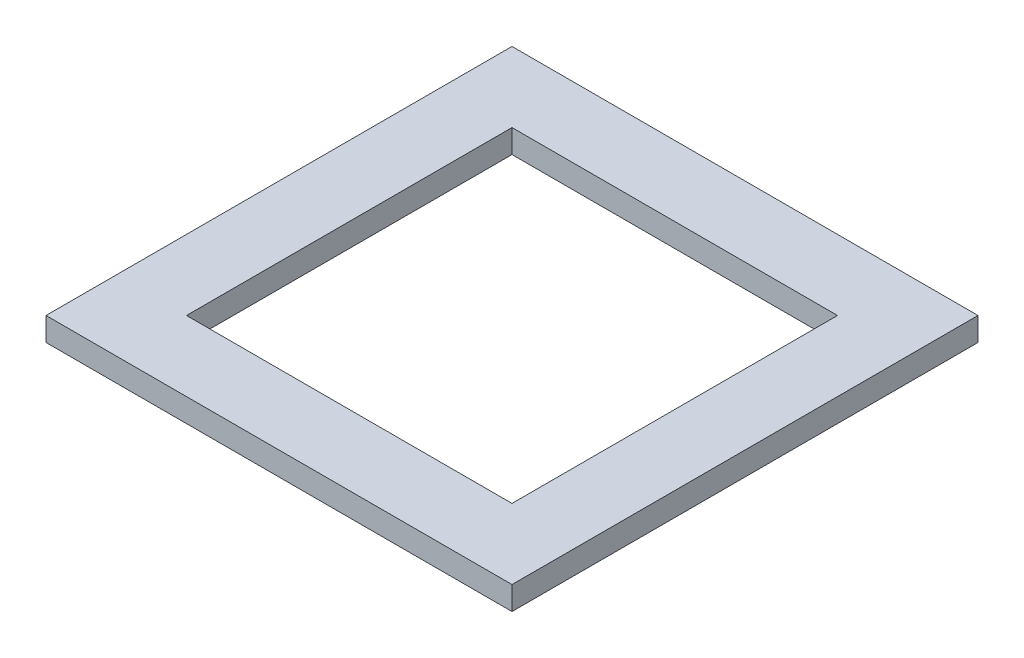
ISO-10303-21;
HEADER;
FILE_DESCRIPTION(('STEP AP214'),'2;1');
FILE_NAME('part.step','',(''),(''),'','','');
FILE_SCHEMA(('AUTOMOTIVE_DESIGN { 1 0 10303 214 1 1 1 1 }'));
ENDSEC;
DATA;
#1=APPLICATION_CONTEXT('core data for automotive mechanical design processes');
#2=APPLICATION_PROTOCOL_DEFINITION('international standard','automotive_design',2000,#1);
#3=PRODUCT_CONTEXT('',#1,'mechanical');
#4=PRODUCT('Part','Part','',(#3));
#5=PRODUCT_RELATED_PRODUCT_CATEGORY('part','',(#4));
#6=PRODUCT_DEFINITION_FORMATION('','',#4);
#7=PRODUCT_DEFINITION_CONTEXT('part definition',#1,'design');
#8=PRODUCT_DEFINITION('design','',#6,#7);
#9=PRODUCT_DEFINITION_SHAPE('','',#8);
#10=(LENGTH_UNIT() NAMED_UNIT(*) SI_UNIT(.MILLI.,.METRE.));
#11=(NAMED_UNIT(*) PLANE_ANGLE_UNIT() SI_UNIT($,.RADIAN.));
#12=(NAMED_UNIT(*) SI_UNIT($,.STERADIAN.) SOLID_ANGLE_UNIT());
#13=UNCERTAINTY_MEASURE_WITH_UNIT(LENGTH_MEASURE(1.E-05),#10,'distance_accuracy_value','');
#14=(GEOMETRIC_REPRESENTATION_CONTEXT(3) GLOBAL_UNCERTAINTY_ASSIGNED_CONTEXT((#13)) GLOBAL_UNIT_ASSIGNED_CONTEXT((#10,
#11,#12)) REPRESENTATION_CONTEXT('',''));
#15=CARTESIAN_POINT('',(0.,0.,0.));
#16=DIRECTION('',(0.,0.,1.));
#17=DIRECTION('',(1.,0.,0.));
#18=AXIS2_PLACEMENT_3D('',#15,#16,#17);
#19=CARTESIAN_POINT('',(0.,1.,9.95));
#20=DIRECTION('',(0.,0.,-1.));
#21=DIRECTION('',(-1.,0.,0.));
#22=AXIS2_PLACEMENT_3D('',#19,#20,#21);
#23=PLANE('',#22);
#24=DIRECTION('',(1.,0.,0.));
#25=VECTOR('',#24,1.);
#26=CARTESIAN_POINT('',(0.,0.,9.95));
#27=LINE('',#26,#25);
#28=CARTESIAN_POINT('',(-9.95,0.,9.95));
#29=VERTEX_POINT('',#28);
#30=CARTESIAN_POINT('',(9.95,0.,9.95));
#31=VERTEX_POINT('',#30);
#32=EDGE_CURVE('E149',#29,#31,#27,.T.);
#33=ORIENTED_EDGE('',*,*,#32,.T.);
#34=DIRECTION('',(0.,-1.,0.));
#35=VECTOR('',#34,1.);
#36=CARTESIAN_POINT('',(9.95,1.,9.95));
#37=LINE('',#36,#35);
#38=CARTESIAN_POINT('',(9.95,1.,9.95));
#39=VERTEX_POINT('',#38);
#40=EDGE_CURVE('E11',#39,#31,#37,.T.);
#41=ORIENTED_EDGE('',*,*,#40,.F.);
#42=DIRECTION('',(1.,0.,0.));
#43=VECTOR('',#42,1.);
#44=CARTESIAN_POINT('',(0.,1.,9.95));
#45=LINE('',#44,#43);
#46=CARTESIAN_POINT('',(-9.95,1.,9.95));
#47=VERTEX_POINT('',#46);
#48=EDGE_CURVE('E121',#47,#39,#45,.T.);
#49=ORIENTED_EDGE('',*,*,#48,.F.);
#50=DIRECTION('',(0.,-1.,0.));
#51=VECTOR('',#50,1.);
#52=CARTESIAN_POINT('',(-9.95,1.,9.95));
#53=LINE('',#52,#51);
#54=EDGE_CURVE('E61',#47,#29,#53,.T.);
#55=ORIENTED_EDGE('',*,*,#54,.T.);
#56=EDGE_LOOP('',(#33,#41,#49,#55));
#57=FACE_BOUND('',#56,.T.);
#58=ADVANCED_FACE('F42',(#57),#23,.F.);
#59=CARTESIAN_POINT('',(9.95,1.,0.));
#60=DIRECTION('',(-1.,0.,0.));
#61=DIRECTION('',(0.,0.,1.));
#62=AXIS2_PLACEMENT_3D('',#59,#60,#61);
#63=PLANE('',#62);
#64=DIRECTION('',(0.,0.,-1.));
#65=VECTOR('',#64,1.);
#66=CARTESIAN_POINT('',(9.95,0.,0.));
#67=LINE('',#66,#65);
#68=CARTESIAN_POINT('',(9.95,0.,-9.95));
#69=VERTEX_POINT('',#68);
#70=EDGE_CURVE('E127',#31,#69,#67,.T.);
#71=ORIENTED_EDGE('',*,*,#70,.T.);
#72=DIRECTION('',(0.,-1.,0.));
#73=VECTOR('',#72,1.);
#74=CARTESIAN_POINT('',(9.95,1.,-9.95));
#75=LINE('',#74,#73);
#76=CARTESIAN_POINT('',(9.95,1.,-9.95));
#77=VERTEX_POINT('',#76);
#78=EDGE_CURVE('E52',#77,#69,#75,.T.);
#79=ORIENTED_EDGE('',*,*,#78,.F.);
#80=DIRECTION('',(0.,0.,-1.));
#81=VECTOR('',#80,1.);
#82=CARTESIAN_POINT('',(9.95,1.,0.));
#83=LINE('',#82,#81);
#84=EDGE_CURVE('E115',#39,#77,#83,.T.);
#85=ORIENTED_EDGE('',*,*,#84,.F.);
#86=ORIENTED_EDGE('',*,*,#40,.T.);
#87=EDGE_LOOP('',(#71,#79,#85,#86));
#88=FACE_BOUND('',#87,.T.);
#89=ADVANCED_FACE('F126',(#88),#63,.F.);
#90=CARTESIAN_POINT('',(0.,1.,-9.95));
#91=DIRECTION('',(0.,0.,-1.));
#92=DIRECTION('',(-1.,0.,0.));
#93=AXIS2_PLACEMENT_3D('',#90,#91,#92);
#94=PLANE('',#93);
#95=DIRECTION('',(1.,0.,0.));
#96=VECTOR('',#95,1.);
#97=CARTESIAN_POINT('',(0.,0.,-9.95));
#98=LINE('',#97,#96);
#99=CARTESIAN_POINT('',(-9.95,0.,-9.95));
#100=VERTEX_POINT('',#99);
#101=EDGE_CURVE('E152',#100,#69,#98,.T.);
#102=ORIENTED_EDGE('',*,*,#101,.F.);
#103=DIRECTION('',(0.,-1.,0.));
#104=VECTOR('',#103,1.);
#105=CARTESIAN_POINT('',(-9.95,1.,-9.95));
#106=LINE('',#105,#104);
#107=CARTESIAN_POINT('',(-9.95,1.,-9.95));
#108=VERTEX_POINT('',#107);
#109=EDGE_CURVE('E87',#108,#100,#106,.T.);
#110=ORIENTED_EDGE('',*,*,#109,.F.);
#111=DIRECTION('',(1.,0.,0.));
#112=VECTOR('',#111,1.);
#113=CARTESIAN_POINT('',(0.,1.,-9.95));
#114=LINE('',#113,#112);
#115=EDGE_CURVE('E120',#108,#77,#114,.T.);
#116=ORIENTED_EDGE('',*,*,#115,.T.);
#117=ORIENTED_EDGE('',*,*,#78,.T.);
#118=EDGE_LOOP('',(#102,#110,#116,#117));
#119=FACE_BOUND('',#118,.T.);
#120=ADVANCED_FACE('F131',(#119),#94,.T.);
#121=CARTESIAN_POINT('',(6.95,1.,0.));
#122=DIRECTION('',(-1.,0.,0.));
#123=DIRECTION('',(0.,0.,1.));
#124=AXIS2_PLACEMENT_3D('',#121,#122,#123);
#125=PLANE('',#124);
#126=DIRECTION('',(0.,0.,-1.));
#127=VECTOR('',#126,1.);
#128=CARTESIAN_POINT('',(6.95,0.,0.));
#129=LINE('',#128,#127);
#130=CARTESIAN_POINT('',(6.95,0.,6.95));
#131=VERTEX_POINT('',#130);
#132=CARTESIAN_POINT('',(6.95,0.,-6.95));
#133=VERTEX_POINT('',#132);
#134=EDGE_CURVE('E138',#131,#133,#129,.T.);
#135=ORIENTED_EDGE('',*,*,#134,.F.);
#136=DIRECTION('',(0.,-1.,0.));
#137=VECTOR('',#136,1.);
#138=CARTESIAN_POINT('',(6.95,1.,6.95));
#139=LINE('',#138,#137);
#140=CARTESIAN_POINT('',(6.95,1.,6.95));
#141=VERTEX_POINT('',#140);
#142=EDGE_CURVE('E46',#141,#131,#139,.T.);
#143=ORIENTED_EDGE('',*,*,#142,.F.);
#144=DIRECTION('',(0.,0.,-1.));
#145=VECTOR('',#144,1.);
#146=CARTESIAN_POINT('',(6.95,1.,0.));
#147=LINE('',#146,#145);
#148=CARTESIAN_POINT('',(6.95,1.,-6.95));
#149=VERTEX_POINT('',#148);
#150=EDGE_CURVE('E157',#141,#149,#147,.T.);
#151=ORIENTED_EDGE('',*,*,#150,.T.);
#152=DIRECTION('',(0.,-1.,0.));
#153=VECTOR('',#152,1.);
#154=CARTESIAN_POINT('',(6.95,1.,-6.95));
#155=LINE('',#154,#153);
#156=EDGE_CURVE('E134',#149,#133,#155,.T.);
#157=ORIENTED_EDGE('',*,*,#156,.T.);
#158=EDGE_LOOP('',(#135,#143,#151,#157));
#159=FACE_BOUND('',#158,.T.);
#160=ADVANCED_FACE('F44',(#159),#125,.T.);
#161=CARTESIAN_POINT('',(0.,1.,6.95));
#162=DIRECTION('',(0.,0.,-1.));
#163=DIRECTION('',(-1.,0.,0.));
#164=AXIS2_PLACEMENT_3D('',#161,#162,#163);
#165=PLANE('',#164);
#166=DIRECTION('',(1.,0.,0.));
#167=VECTOR('',#166,1.);
#168=CARTESIAN_POINT('',(0.,0.,6.95));
#169=LINE('',#168,#167);
#170=CARTESIAN_POINT('',(-6.95,0.,6.95));
#171=VERTEX_POINT('',#170);
#172=EDGE_CURVE('E141',#171,#131,#169,.T.);
#173=ORIENTED_EDGE('',*,*,#172,.F.);
#174=DIRECTION('',(0.,-1.,0.));
#175=VECTOR('',#174,1.);
#176=CARTESIAN_POINT('',(-6.95,1.,6.95));
#177=LINE('',#176,#175);
#178=CARTESIAN_POINT('',(-6.95,1.,6.95));
#179=VERTEX_POINT('',#178);
#180=EDGE_CURVE('E163',#179,#171,#177,.T.);
#181=ORIENTED_EDGE('',*,*,#180,.F.);
#182=DIRECTION('',(1.,0.,0.));
#183=VECTOR('',#182,1.);
#184=CARTESIAN_POINT('',(0.,1.,6.95));
#185=LINE('',#184,#183);
#186=EDGE_CURVE('E172',#179,#141,#185,.T.);
#187=ORIENTED_EDGE('',*,*,#186,.T.);
#188=ORIENTED_EDGE('',*,*,#142,.T.);
#189=EDGE_LOOP('',(#173,#181,#187,#188));
#190=FACE_BOUND('',#189,.T.);
#191=ADVANCED_FACE('F170',(#190),#165,.T.);
#192=CARTESIAN_POINT('',(-6.95,1.,0.));
#193=DIRECTION('',(-1.,0.,0.));
#194=DIRECTION('',(0.,0.,1.));
#195=AXIS2_PLACEMENT_3D('',#192,#193,#194);
#196=PLANE('',#195);
#197=DIRECTION('',(0.,0.,-1.));
#198=VECTOR('',#197,1.);
#199=CARTESIAN_POINT('',(-6.95,0.,0.));
#200=LINE('',#199,#198);
#201=CARTESIAN_POINT('',(-6.95,0.,-6.95));
#202=VERTEX_POINT('',#201);
#203=EDGE_CURVE('E144',#171,#202,#200,.T.);
#204=ORIENTED_EDGE('',*,*,#203,.T.);
#205=DIRECTION('',(0.,-1.,0.));
#206=VECTOR('',#205,1.);
#207=CARTESIAN_POINT('',(-6.95,1.,-6.95));
#208=LINE('',#207,#206);
#209=CARTESIAN_POINT('',(-6.95,1.,-6.95));
#210=VERTEX_POINT('',#209);
#211=EDGE_CURVE('E161',#210,#202,#208,.T.);
#212=ORIENTED_EDGE('',*,*,#211,.F.);
#213=DIRECTION('',(0.,0.,-1.));
#214=VECTOR('',#213,1.);
#215=CARTESIAN_POINT('',(-6.95,1.,0.));
#216=LINE('',#215,#214);
#217=EDGE_CURVE('E185',#179,#210,#216,.T.);
#218=ORIENTED_EDGE('',*,*,#217,.F.);
#219=ORIENTED_EDGE('',*,*,#180,.T.);
#220=EDGE_LOOP('',(#204,#212,#218,#219));
#221=FACE_BOUND('',#220,.T.);
#222=ADVANCED_FACE('F179',(#221),#196,.F.);
#223=CARTESIAN_POINT('',(0.,1.,-6.95));
#224=DIRECTION('',(0.,0.,-1.));
#225=DIRECTION('',(-1.,0.,0.));
#226=AXIS2_PLACEMENT_3D('',#223,#224,#225);
#227=PLANE('',#226);
#228=DIRECTION('',(1.,0.,0.));
#229=VECTOR('',#228,1.);
#230=CARTESIAN_POINT('',(0.,0.,-6.95));
#231=LINE('',#230,#229);
#232=EDGE_CURVE('E146',#202,#133,#231,.T.);
#233=ORIENTED_EDGE('',*,*,#232,.T.);
#234=ORIENTED_EDGE('',*,*,#156,.F.);
#235=DIRECTION('',(1.,0.,0.));
#236=VECTOR('',#235,1.);
#237=CARTESIAN_POINT('',(0.,1.,-6.95));
#238=LINE('',#237,#236);
#239=EDGE_CURVE('E183',#210,#149,#238,.T.);
#240=ORIENTED_EDGE('',*,*,#239,.F.);
#241=ORIENTED_EDGE('',*,*,#211,.T.);
#242=EDGE_LOOP('',(#233,#234,#240,#241));
#243=FACE_BOUND('',#242,.T.);
#244=ADVANCED_FACE('F182',(#243),#227,.F.);
#245=CARTESIAN_POINT('',(-9.95,1.,0.));
#246=DIRECTION('',(-1.,0.,0.));
#247=DIRECTION('',(0.,0.,1.));
#248=AXIS2_PLACEMENT_3D('',#245,#246,#247);
#249=PLANE('',#248);
#250=DIRECTION('',(0.,0.,-1.));
#251=VECTOR('',#250,1.);
#252=CARTESIAN_POINT('',(-9.95,0.,0.));
#253=LINE('',#252,#251);
#254=EDGE_CURVE('E154',#29,#100,#253,.T.);
#255=ORIENTED_EDGE('',*,*,#254,.F.);
#256=ORIENTED_EDGE('',*,*,#54,.F.);
#257=DIRECTION('',(0.,0.,-1.));
#258=VECTOR('',#257,1.);
#259=CARTESIAN_POINT('',(-9.95,1.,0.));
#260=LINE('',#259,#258);
#261=EDGE_CURVE('E132',#47,#108,#260,.T.);
#262=ORIENTED_EDGE('',*,*,#261,.T.);
#263=ORIENTED_EDGE('',*,*,#109,.T.);
#264=EDGE_LOOP('',(#255,#256,#262,#263));
#265=FACE_BOUND('',#264,.T.);
#266=ADVANCED_FACE('F191',(#265),#249,.T.);
#267=CARTESIAN_POINT('',(0.,1.,0.));
#268=DIRECTION('',(0.,1.,0.));
#269=DIRECTION('',(0.,0.,1.));
#270=AXIS2_PLACEMENT_3D('',#267,#268,#269);
#271=PLANE('',#270);
#272=ORIENTED_EDGE('',*,*,#150,.F.);
#273=ORIENTED_EDGE('',*,*,#186,.F.);
#274=ORIENTED_EDGE('',*,*,#217,.T.);
#275=ORIENTED_EDGE('',*,*,#239,.T.);
#276=EDGE_LOOP('',(#272,#273,#274,#275));
#277=FACE_BOUND('',#276,.T.);
#278=ORIENTED_EDGE('',*,*,#48,.T.);
#279=ORIENTED_EDGE('',*,*,#84,.T.);
#280=ORIENTED_EDGE('',*,*,#115,.F.);
#281=ORIENTED_EDGE('',*,*,#261,.F.);
#282=EDGE_LOOP('',(#278,#279,#280,#281));
#283=FACE_BOUND('',#282,.T.);
#284=ADVANCED_FACE('F117',(#277,#283),#271,.T.);
#285=CARTESIAN_POINT('',(0.,0.,0.));
#286=DIRECTION('',(0.,1.,0.));
#287=DIRECTION('',(0.,0.,1.));
#288=AXIS2_PLACEMENT_3D('',#285,#286,#287);
#289=PLANE('',#288);
#290=ORIENTED_EDGE('',*,*,#134,.T.);
#291=ORIENTED_EDGE('',*,*,#232,.F.);
#292=ORIENTED_EDGE('',*,*,#203,.F.);
#293=ORIENTED_EDGE('',*,*,#172,.T.);
#294=EDGE_LOOP('',(#290,#291,#292,#293));
#295=FACE_BOUND('',#294,.T.);
#296=ORIENTED_EDGE('',*,*,#32,.F.);
#297=ORIENTED_EDGE('',*,*,#254,.T.);
#298=ORIENTED_EDGE('',*,*,#101,.T.);
#299=ORIENTED_EDGE('',*,*,#70,.F.);
#300=EDGE_LOOP('',(#296,#297,#298,#299));
#301=FACE_BOUND('',#300,.T.);
#302=ADVANCED_FACE('F176',(#295,#301),#289,.F.);
#303=CLOSED_SHELL('',(#58,#89,#120,#160,#191,#222,#244,#266,#284,#302));
#304=MANIFOLD_SOLID_BREP('B2',#303);
#305=ADVANCED_BREP_SHAPE_REPRESENTATION('',(#18,#304),#14);
#306=SHAPE_DEFINITION_REPRESENTATION(#9,#305);
ENDSEC;
END-ISO-10303-21;
